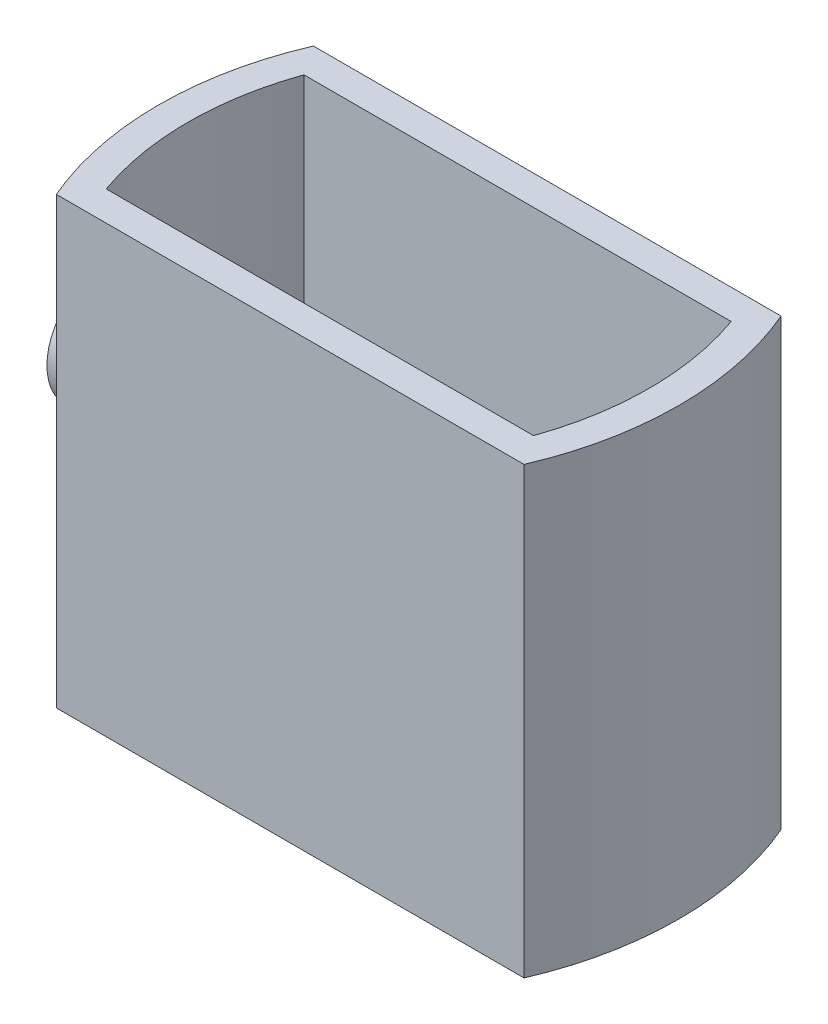
ISO-10303-21;
HEADER;
FILE_DESCRIPTION(('STEP AP214'),'2;1');
FILE_NAME('part.step','',(''),(''),'','','');
FILE_SCHEMA(('AUTOMOTIVE_DESIGN { 1 0 10303 214 1 1 1 1 }'));
ENDSEC;
DATA;
#1=APPLICATION_CONTEXT('core data for automotive mechanical design processes');
#2=APPLICATION_PROTOCOL_DEFINITION('international standard','automotive_design',2000,#1);
#3=PRODUCT_CONTEXT('',#1,'mechanical');
#4=PRODUCT('Part','Part','',(#3));
#5=PRODUCT_RELATED_PRODUCT_CATEGORY('part','',(#4));
#6=PRODUCT_DEFINITION_FORMATION('','',#4);
#7=PRODUCT_DEFINITION_CONTEXT('part definition',#1,'design');
#8=PRODUCT_DEFINITION('design','',#6,#7);
#9=PRODUCT_DEFINITION_SHAPE('','',#8);
#10=(LENGTH_UNIT() NAMED_UNIT(*) SI_UNIT(.MILLI.,.METRE.));
#11=(NAMED_UNIT(*) PLANE_ANGLE_UNIT() SI_UNIT($,.RADIAN.));
#12=(NAMED_UNIT(*) SI_UNIT($,.STERADIAN.) SOLID_ANGLE_UNIT());
#13=UNCERTAINTY_MEASURE_WITH_UNIT(LENGTH_MEASURE(1.E-05),#10,'distance_accuracy_value','');
#14=(GEOMETRIC_REPRESENTATION_CONTEXT(3) GLOBAL_UNCERTAINTY_ASSIGNED_CONTEXT((#13)) GLOBAL_UNIT_ASSIGNED_CONTEXT((#10,
#11,#12)) REPRESENTATION_CONTEXT('',''));
#15=CARTESIAN_POINT('',(0.,0.,0.));
#16=DIRECTION('',(0.,0.,1.));
#17=DIRECTION('',(1.,0.,0.));
#18=AXIS2_PLACEMENT_3D('',#15,#16,#17);
#19=CARTESIAN_POINT('',(33.2842712474619,45.,-10.));
#20=DIRECTION('',(0.,-1.,0.));
#21=DIRECTION('',(0.,0.,-1.));
#22=AXIS2_PLACEMENT_3D('',#19,#20,#21);
#23=CYLINDRICAL_SURFACE('',#22,33.);
#24=CARTESIAN_POINT('',(33.2842712474619,0.,-10.));
#25=DIRECTION('',(0.,1.,0.));
#26=DIRECTION('',(0.,0.,1.));
#27=AXIS2_PLACEMENT_3D('',#24,#25,#26);
#28=CIRCLE('',#27,33.);
#29=CARTESIAN_POINT('',(2.95276947125568,0.,-23.));
#30=VERTEX_POINT('',#29);
#31=CARTESIAN_POINT('',(2.9527694712557,0.,3.));
#32=VERTEX_POINT('',#31);
#33=EDGE_CURVE('E180',#30,#32,#28,.T.);
#34=ORIENTED_EDGE('',*,*,#33,.T.);
#35=DIRECTION('',(0.,-1.,0.));
#36=VECTOR('',#35,1.);
#37=CARTESIAN_POINT('',(2.9527694712557,45.,3.));
#38=LINE('',#37,#36);
#39=CARTESIAN_POINT('',(2.9527694712557,45.,3.));
#40=VERTEX_POINT('',#39);
#41=EDGE_CURVE('E207',#40,#32,#38,.T.);
#42=ORIENTED_EDGE('',*,*,#41,.F.);
#43=CARTESIAN_POINT('',(33.2842712474619,45.,-10.));
#44=DIRECTION('',(0.,1.,0.));
#45=DIRECTION('',(0.,0.,1.));
#46=AXIS2_PLACEMENT_3D('',#43,#44,#45);
#47=CIRCLE('',#46,33.);
#48=CARTESIAN_POINT('',(2.95276947125568,45.,-23.));
#49=VERTEX_POINT('',#48);
#50=EDGE_CURVE('E181',#49,#40,#47,.T.);
#51=ORIENTED_EDGE('',*,*,#50,.F.);
#52=DIRECTION('',(0.,-1.,0.));
#53=VECTOR('',#52,1.);
#54=CARTESIAN_POINT('',(2.95276947125568,45.,-23.));
#55=LINE('',#54,#53);
#56=EDGE_CURVE('E191',#49,#30,#55,.T.);
#57=ORIENTED_EDGE('',*,*,#56,.T.);
#58=EDGE_LOOP('',(#34,#42,#51,#57));
#59=FACE_BOUND('',#58,.T.);
#60=CARTESIAN_POINT('',(0.834309768285982,22.5298800502734,-4.));
#61=CARTESIAN_POINT('',(0.834311207050992,22.6969470468249,-3.99999710433349));
#62=CARTESIAN_POINT('',(0.833017102269688,22.8639762389532,-4.00697986993228));
#63=CARTESIAN_POINT('',(0.827881797372019,23.1968817985023,-4.03485125201145));
#64=CARTESIAN_POINT('',(0.824040124479655,23.3627579461672,-4.05574244961225));
#65=CARTESIAN_POINT('',(0.813917556073885,23.6922074969818,-4.11128853761444));
#66=CARTESIAN_POINT('',(0.807635234979211,23.8557794963096,-4.14595147234873));
#67=CARTESIAN_POINT('',(0.792812964129984,24.1794261892272,-4.22878622637898));
#68=CARTESIAN_POINT('',(0.784272184587287,24.3394995739275,-4.27696301124231));
#69=CARTESIAN_POINT('',(0.765194002031665,24.6547597342547,-4.38638333662461));
#70=CARTESIAN_POINT('',(0.754659182785857,24.8099525337316,-4.44760998065251));
#71=CARTESIAN_POINT('',(0.731883148899789,25.11465548327,-4.58273848642752));
#72=CARTESIAN_POINT('',(0.719641305397532,25.2641635131302,-4.65664502172616));
#73=CARTESIAN_POINT('',(0.693806914762158,25.5563526088892,-4.81654681687286));
#74=CARTESIAN_POINT('',(0.68021500803482,25.6990368645254,-4.90253635307126));
#75=CARTESIAN_POINT('',(0.652050718739532,25.9767497303918,-5.08606047704174));
#76=CARTESIAN_POINT('',(0.637477971804304,26.1117754608884,-5.18359936555333));
#77=CARTESIAN_POINT('',(0.607609903109034,26.3745400520298,-5.39057029759614));
#78=CARTESIAN_POINT('',(0.592308758957431,26.5021912848753,-5.50011276599489));
#79=CARTESIAN_POINT('',(0.561546625216796,26.747885647199,-5.72955598579486));
#80=CARTESIAN_POINT('',(0.546085578517219,26.8659252001229,-5.84946055908649));
#81=CARTESIAN_POINT('',(0.515445816845272,27.0915033105964,-6.09873859480213));
#82=CARTESIAN_POINT('',(0.500267017898053,27.1990450332953,-6.22810918246445));
#83=CARTESIAN_POINT('',(0.470604333153024,27.4029611080186,-6.4955221832749));
#84=CARTESIAN_POINT('',(0.456120705554213,27.4993313292708,-6.63356777518038));
#85=CARTESIAN_POINT('',(0.428163516937484,27.6807936475005,-6.91831497645332));
#86=CARTESIAN_POINT('',(0.414697492304395,27.7658046157517,-7.06506905345363));
#87=CARTESIAN_POINT('',(0.389262221119081,27.9231769250129,-7.36540209909515));
#88=CARTESIAN_POINT('',(0.377293535155045,27.9955335323709,-7.51898359485917));
#89=CARTESIAN_POINT('',(0.355205254476122,28.126986202578,-7.83178536210799));
#90=CARTESIAN_POINT('',(0.345084864877921,28.1860879683452,-7.99100317428556));
#91=CARTESIAN_POINT('',(0.326970831275491,28.2906319898892,-8.31399646768902));
#92=CARTESIAN_POINT('',(0.318977962306166,28.3360692686076,-8.47777358589203));
#93=CARTESIAN_POINT('',(0.298719547884425,28.4503964023707,-8.97043441500052));
#94=CARTESIAN_POINT('',(0.289896994150371,28.4988974909288,-9.30446143905058));
#95=CARTESIAN_POINT('',(0.282569638067994,28.5392610535621,-9.97583675238667));
#96=CARTESIAN_POINT('',(0.284064007406454,28.5311280746077,-10.3131847728688));
#97=CARTESIAN_POINT('',(0.297102792372699,28.4590030153549,-10.9776541129842));
#98=CARTESIAN_POINT('',(0.308528616351763,28.3956700545941,-11.3048490887181));
#99=CARTESIAN_POINT('',(0.340018545015216,28.2159636930678,-11.9438760833778));
#100=CARTESIAN_POINT('',(0.360082950405559,28.0995884459108,-12.2557075670849));
#101=CARTESIAN_POINT('',(0.406793716014287,27.8164705373666,-12.8570977010309));
#102=CARTESIAN_POINT('',(0.433474678133732,27.6494620287455,-13.1465284160774));
#103=CARTESIAN_POINT('',(0.490464321434872,27.2700124699342,-13.6935031622188));
#104=CARTESIAN_POINT('',(0.520773350166418,27.0575670655903,-13.9510441336273));
#105=CARTESIAN_POINT('',(0.582174010526942,26.5896346620641,-14.4308332800817));
#106=CARTESIAN_POINT('',(0.613270624471893,26.3335709899584,-14.6525187629826));
#107=CARTESIAN_POINT('',(0.672322383831015,25.7875978650687,-15.0498781780911));
#108=CARTESIAN_POINT('',(0.700277488531327,25.4976879737382,-15.225551514022));
#109=CARTESIAN_POINT('',(0.749887045610989,24.8915325170496,-15.526046142352));
#110=CARTESIAN_POINT('',(0.771531847279287,24.5752475548737,-15.6507896602823));
#111=CARTESIAN_POINT('',(0.805919242954319,23.9257277010885,-15.8452113078842));
#112=CARTESIAN_POINT('',(0.818662780964874,23.592494610898,-15.9148952768771));
#113=CARTESIAN_POINT('',(0.833619125028542,22.923600646495,-15.9964065355699));
#114=CARTESIAN_POINT('',(0.835978737170392,22.5880412520994,-16.0090404560043));
#115=CARTESIAN_POINT('',(0.830292394132216,21.9196063987343,-15.9782516420348));
#116=CARTESIAN_POINT('',(0.822246921235445,21.5867308160877,-15.9348315057775));
#117=CARTESIAN_POINT('',(0.796793365566566,20.9357390176699,-15.7938582944236));
#118=CARTESIAN_POINT('',(0.779457846360131,20.6175288965994,-15.6967245852953));
#119=CARTESIAN_POINT('',(0.737439524304479,20.0019008954381,-15.4515249075209));
#120=CARTESIAN_POINT('',(0.712756208356009,19.7044844691701,-15.3034553818964));
#121=CARTESIAN_POINT('',(0.658487219924136,19.1353224560069,-14.9587176597247));
#122=CARTESIAN_POINT('',(0.628851091161043,18.863891672688,-14.7615378161347));
#123=CARTESIAN_POINT('',(0.568159269713723,18.3576789988143,-14.3248688706109));
#124=CARTESIAN_POINT('',(0.537103457505208,18.1229002013933,-14.0853762014456));
#125=CARTESIAN_POINT('',(0.476601624494936,17.6936614236151,-13.567289950794));
#126=CARTESIAN_POINT('',(0.447180606477683,17.4997426530667,-13.288244641256));
#127=CARTESIAN_POINT('',(0.393678962304662,17.1615414631335,-12.7010539158412));
#128=CARTESIAN_POINT('',(0.369598139367316,17.0172572146513,-12.3929095728356));
#129=CARTESIAN_POINT('',(0.329595488360193,16.783234704372,-11.7578593043535));
#130=CARTESIAN_POINT('',(0.313633234144535,16.6932257558349,-11.4310555340042));
#131=CARTESIAN_POINT('',(0.29150348307946,16.5694625997388,-10.7664654063309));
#132=CARTESIAN_POINT('',(0.285335019803886,16.5357028416377,-10.4286801359904));
#133=CARTESIAN_POINT('',(0.283933032375379,16.5280337160894,-9.92412465964711));
#134=CARTESIAN_POINT('',(0.284742665578209,16.5324667293458,-9.75741956133508));
#135=CARTESIAN_POINT('',(0.288863907032769,16.5551771273463,-9.42500311314808));
#136=CARTESIAN_POINT('',(0.292174571683086,16.5734492907946,-9.25929141223973));
#137=CARTESIAN_POINT('',(0.301211473783175,16.6237112415082,-8.92998180037912));
#138=CARTESIAN_POINT('',(0.306938560346232,16.6557058508078,-8.76638465331259));
#139=CARTESIAN_POINT('',(0.320645292898395,16.7331491184936,-8.44256296011904));
#140=CARTESIAN_POINT('',(0.328624130104579,16.7785929464795,-8.28233722521298));
#141=CARTESIAN_POINT('',(0.346603965841608,16.8825320386561,-7.96651394513209));
#142=CARTESIAN_POINT('',(0.356602475212811,16.9410112463935,-7.81091097078312));
#143=CARTESIAN_POINT('',(0.378349465815467,17.0705976414067,-7.5052492813374));
#144=CARTESIAN_POINT('',(0.390097322641404,17.1417003246408,-7.35518861174606));
#145=CARTESIAN_POINT('',(0.415030408686995,17.2960674330648,-7.06150782553733));
#146=CARTESIAN_POINT('',(0.428216211947667,17.3793367198124,-6.91789031361532));
#147=CARTESIAN_POINT('',(0.455658298588059,17.5573997108216,-6.63816743173614));
#148=CARTESIAN_POINT('',(0.46991420839022,17.6521894003632,-6.5020594686973));
#149=CARTESIAN_POINT('',(0.499317594449547,17.854060084822,-6.23636768521799));
#150=CARTESIAN_POINT('',(0.514474700989465,17.9612934565583,-6.10690067916726));
#151=CARTESIAN_POINT('',(0.545069769387928,18.1861817415128,-5.8574800030546));
#152=CARTESIAN_POINT('',(0.560507629742685,18.3038329455304,-5.73752297562916));
#153=CARTESIAN_POINT('',(0.591248598227235,18.5488615714,-5.50781686444138));
#154=CARTESIAN_POINT('',(0.606551620193833,18.6762447712566,-5.39807393202892));
#155=CARTESIAN_POINT('',(0.636578866441934,18.9397626429322,-5.1896709743231));
#156=CARTESIAN_POINT('',(0.651303301762846,19.0758940751781,-5.09100688316674));
#157=CARTESIAN_POINT('',(0.679891949863692,19.3572924900959,-4.90456782351758));
#158=CARTESIAN_POINT('',(0.693747212192895,19.502630759713,-4.81689902638604));
#159=CARTESIAN_POINT('',(0.720044012545855,19.8002540529136,-4.65417002493858));
#160=CARTESIAN_POINT('',(0.7324860705455,19.9525364923594,-4.57910517821784));
#161=CARTESIAN_POINT('',(0.75558956002518,20.2629313678491,-4.44215023459087));
#162=CARTESIAN_POINT('',(0.766252164471846,20.4210398789137,-4.38025145153159));
#163=CARTESIAN_POINT('',(0.785488942716035,20.7419956122943,-4.27005527885427));
#164=CARTESIAN_POINT('',(0.794063546153581,20.9048418520126,-4.22175509078507));
#165=CARTESIAN_POINT('',(0.81217650811176,21.3078028745834,-4.12064396841226));
#166=CARTESIAN_POINT('',(0.82043372775197,21.5499322645336,-4.07545977914677));
#167=CARTESIAN_POINT('',(0.831499232565769,22.0380284785789,-4.01514029257442));
#168=CARTESIAN_POINT('',(0.834307650749223,22.2839952088537,-4.00000426176632));
#169=CARTESIAN_POINT('',(0.834309768285982,22.5298800502734,-4.));
#170=B_SPLINE_CURVE_WITH_KNOTS('',3,(#60,#61,#62,#63,#64,#65,#66,#67,#68,#69,#70,#71,#72,#73,
#74,#75,#76,#77,#78,#79,#80,#81,#82,#83,#84,#85,#86,#87,#88,#89,#90,#91,#92,#93,#94,#95,#96,#97,
#98,#99,#100,#101,#102,#103,#104,#105,#106,#107,#108,#109,#110,#111,#112,#113,#114,#115,#116,
#117,#118,#119,#120,#121,#122,#123,#124,#125,#126,#127,#128,#129,#130,#131,#132,#133,#134,#135,
#136,#137,#138,#139,#140,#141,#142,#143,#144,#145,#146,#147,#148,#149,#150,#151,#152,#153,#154,
#155,#156,#157,#158,#159,#160,#161,#162,#163,#164,#165,#166,#167,#168,#169),.UNSPECIFIED.,.T.,
.F.,(4,2,2,2,2,2,2,2,2,2,2,2,2,2,2,2,2,2,2,2,2,2,2,2,2,2,2,2,2,2,2,2,2,2,2,2,2,2,2,2,2,2,2,2,2,
2,2,2,2,2,2,2,2,2,4),(0.,0.500985141416481,1.00206328135099,1.50343454186193,2.00499026951617,
2.50590050338956,3.00699576084691,3.50785444749858,4.00890023359659,4.51501940801334,
5.02132605937388,5.5274795821203,6.03381966712669,6.54360211345409,7.05357484952594,
7.56332774621864,8.07326608753258,9.08087313825729,10.0883992923303,11.0840573145674,
12.0797499981095,13.0807638104178,14.0818735914816,15.0974244812227,16.112988530953,
17.1300976903803,18.147098966162,19.1496748952068,20.152204355794,21.1470149256815,
22.1418949798464,23.14760856284,24.1534069741702,25.171789632904,26.1901347588785,
27.2033581660772,28.216481584775,28.7162920469878,29.2159140323754,29.7157117277426,
30.2153301339433,30.7143364981072,31.2131651738708,31.7121937205521,32.2110488578404,
32.7168299197649,33.2224316202422,33.7283358709149,34.2340538469723,34.7443303702752,
35.2544185294921,35.7641691131274,36.2738147185242,37.0111695626684,37.7485064071289),.UNSPECIFIED.);
#171=CARTESIAN_POINT('',(0.834309768285982,22.5298800502734,-4.));
#172=VERTEX_POINT('',#171);
#173=EDGE_CURVE('E11',#172,#172,#170,.T.);
#174=ORIENTED_EDGE('',*,*,#173,.F.);
#175=EDGE_LOOP('',(#174));
#176=FACE_BOUND('',#175,.T.);
#177=ADVANCED_FACE('F34',(#59,#176),#23,.T.);
#178=CARTESIAN_POINT('',(19.9442712474619,45.,-10.));
#179=DIRECTION('',(0.,-1.,0.));
#180=DIRECTION('',(0.,0.,-1.));
#181=AXIS2_PLACEMENT_3D('',#178,#179,#180);
#182=CYLINDRICAL_SURFACE('',#181,30.);
#183=DIRECTION('',(0.,-1.,0.));
#184=VECTOR('',#183,1.);
#185=CARTESIAN_POINT('',(48.2285424949238,45.,-20.));
#186=LINE('',#185,#184);
#187=CARTESIAN_POINT('',(48.2285424949238,45.,-20.));
#188=VERTEX_POINT('',#187);
#189=CARTESIAN_POINT('',(48.2285424949238,3.,-20.));
#190=VERTEX_POINT('',#189);
#191=EDGE_CURVE('E178',#188,#190,#186,.T.);
#192=ORIENTED_EDGE('',*,*,#191,.T.);
#193=CARTESIAN_POINT('',(19.9442712474619,3.,-10.));
#194=DIRECTION('',(0.,-1.,0.));
#195=DIRECTION('',(0.,0.,-1.));
#196=AXIS2_PLACEMENT_3D('',#193,#194,#195);
#197=CIRCLE('',#196,30.);
#198=CARTESIAN_POINT('',(48.2285424949238,3.,0.));
#199=VERTEX_POINT('',#198);
#200=EDGE_CURVE('E149',#190,#199,#197,.T.);
#201=ORIENTED_EDGE('',*,*,#200,.T.);
#202=DIRECTION('',(0.,-1.,0.));
#203=VECTOR('',#202,1.);
#204=CARTESIAN_POINT('',(48.2285424949238,45.,0.));
#205=LINE('',#204,#203);
#206=CARTESIAN_POINT('',(48.2285424949238,45.,0.));
#207=VERTEX_POINT('',#206);
#208=EDGE_CURVE('E171',#207,#199,#205,.T.);
#209=ORIENTED_EDGE('',*,*,#208,.F.);
#210=CARTESIAN_POINT('',(19.9442712474619,45.,-10.));
#211=DIRECTION('',(0.,1.,0.));
#212=DIRECTION('',(0.,0.,-1.));
#213=AXIS2_PLACEMENT_3D('',#210,#211,#212);
#214=CIRCLE('',#213,30.);
#215=EDGE_CURVE('E165',#207,#188,#214,.T.);
#216=ORIENTED_EDGE('',*,*,#215,.T.);
#217=EDGE_LOOP('',(#192,#201,#209,#216));
#218=FACE_BOUND('',#217,.T.);
#219=ADVANCED_FACE('F225',(#218),#182,.F.);
#220=CARTESIAN_POINT('',(4.99999999999999,45.,-20.));
#221=DIRECTION('',(0.,0.,1.));
#222=DIRECTION('',(1.,0.,0.));
#223=AXIS2_PLACEMENT_3D('',#220,#221,#222);
#224=PLANE('',#223);
#225=DIRECTION('',(0.,-1.,0.));
#226=VECTOR('',#225,1.);
#227=CARTESIAN_POINT('',(38.1142712474619,3.,-20.));
#228=LINE('',#227,#226);
#229=CARTESIAN_POINT('',(38.1142712474619,3.,-20.));
#230=VERTEX_POINT('',#229);
#231=CARTESIAN_POINT('',(38.1142712474619,0.,-20.));
#232=VERTEX_POINT('',#231);
#233=EDGE_CURVE('E133',#230,#232,#228,.T.);
#234=ORIENTED_EDGE('',*,*,#233,.F.);
#235=DIRECTION('',(1.,0.,0.));
#236=VECTOR('',#235,1.);
#237=CARTESIAN_POINT('',(4.99999999999999,3.,-20.));
#238=LINE('',#237,#236);
#239=EDGE_CURVE('E152',#230,#190,#238,.T.);
#240=ORIENTED_EDGE('',*,*,#239,.T.);
#241=ORIENTED_EDGE('',*,*,#191,.F.);
#242=DIRECTION('',(-1.,0.,0.));
#243=VECTOR('',#242,1.);
#244=CARTESIAN_POINT('',(4.99999999999999,45.,-20.));
#245=LINE('',#244,#243);
#246=CARTESIAN_POINT('',(4.99999999999999,45.,-20.));
#247=VERTEX_POINT('',#246);
#248=EDGE_CURVE('E220',#188,#247,#245,.T.);
#249=ORIENTED_EDGE('',*,*,#248,.T.);
#250=DIRECTION('',(0.,-1.,0.));
#251=VECTOR('',#250,1.);
#252=CARTESIAN_POINT('',(4.99999999999999,45.,-20.));
#253=LINE('',#252,#251);
#254=CARTESIAN_POINT('',(4.99999999999999,3.,-20.));
#255=VERTEX_POINT('',#254);
#256=EDGE_CURVE('E148',#247,#255,#253,.T.);
#257=ORIENTED_EDGE('',*,*,#256,.T.);
#258=CARTESIAN_POINT('',(15.1142712474619,3.,-20.));
#259=VERTEX_POINT('',#258);
#260=EDGE_CURVE('E138',#255,#259,#238,.T.);
#261=ORIENTED_EDGE('',*,*,#260,.T.);
#262=DIRECTION('',(0.,-1.,0.));
#263=VECTOR('',#262,1.);
#264=CARTESIAN_POINT('',(15.1142712474619,3.,-20.));
#265=LINE('',#264,#263);
#266=CARTESIAN_POINT('',(15.1142712474619,0.,-20.));
#267=VERTEX_POINT('',#266);
#268=EDGE_CURVE('E125',#259,#267,#265,.T.);
#269=ORIENTED_EDGE('',*,*,#268,.T.);
#270=DIRECTION('',(-1.,0.,0.));
#271=VECTOR('',#270,1.);
#272=CARTESIAN_POINT('',(4.99999999999999,0.,-20.));
#273=LINE('',#272,#271);
#274=EDGE_CURVE('E158',#232,#267,#273,.T.);
#275=ORIENTED_EDGE('',*,*,#274,.F.);
#276=EDGE_LOOP('',(#234,#240,#241,#249,#257,#261,#269,#275));
#277=FACE_BOUND('',#276,.T.);
#278=ADVANCED_FACE('F146',(#277),#224,.T.);
#279=CARTESIAN_POINT('',(33.2842712474619,45.,-10.));
#280=DIRECTION('',(0.,-1.,0.));
#281=DIRECTION('',(0.,0.,-1.));
#282=AXIS2_PLACEMENT_3D('',#279,#280,#281);
#283=CYLINDRICAL_SURFACE('',#282,30.);
#284=CARTESIAN_POINT('',(3.4346481342633,22.5298800502734,-7.));
#285=CARTESIAN_POINT('',(3.43464616380183,22.3618213577466,-7.0000072798201));
#286=CARTESIAN_POINT('',(3.43321353877771,22.1936515450184,-7.01416942305608));
#287=CARTESIAN_POINT('',(3.42763862189589,21.8619744913745,-7.07045105571267));
#288=CARTESIAN_POINT('',(3.42349334394082,21.6984725961573,-7.11260135534101));
#289=CARTESIAN_POINT('',(3.41296725572507,21.3809825926261,-7.22361965179192));
#290=CARTESIAN_POINT('',(3.40658780097375,21.2269887821008,-7.29247145111795));
#291=CARTESIAN_POINT('',(3.39231383039174,20.9327766733964,-7.45490719782704));
#292=CARTESIAN_POINT('',(3.38441961555469,20.7925556468218,-7.54848623312231));
#293=CARTESIAN_POINT('',(3.36797344614221,20.5293262593013,-7.75808571400379));
#294=CARTESIAN_POINT('',(3.35941944729782,20.4063750217621,-7.8741777456752));
#295=CARTESIAN_POINT('',(3.34263609039642,20.1816672232625,-8.12535485404133));
#296=CARTESIAN_POINT('',(3.33440674720715,20.0799116320544,-8.2604407992803));
#297=CARTESIAN_POINT('',(3.31917975279212,19.9002862792519,-8.54612091504703));
#298=CARTESIAN_POINT('',(3.31218472062205,19.8224670538924,-8.69674701241129));
#299=CARTESIAN_POINT('',(3.30023674118922,19.6932467508273,-9.00901004713747));
#300=CARTESIAN_POINT('',(3.2952837441501,19.641845029165,-9.17064671599534));
#301=CARTESIAN_POINT('',(3.28799225033101,19.5670863222136,-9.49976565177115));
#302=CARTESIAN_POINT('',(3.28564501217736,19.5436355520235,-9.66722641890525));
#303=CARTESIAN_POINT('',(3.28379977950115,19.5251542428722,-10.0037222220668));
#304=CARTESIAN_POINT('',(3.28430171110373,19.5301229670346,-10.1727572171634));
#305=CARTESIAN_POINT('',(3.28809110812632,19.5682634682238,-10.5069665321937));
#306=CARTESIAN_POINT('',(3.29136861291051,19.601334396965,-10.6721524898049));
#307=CARTESIAN_POINT('',(3.30032936951399,19.6945834371132,-10.9946175385136));
#308=CARTESIAN_POINT('',(3.3060126525833,19.7547619006361,-11.1518965268732));
#309=CARTESIAN_POINT('',(3.31916312294444,19.9006283400367,-11.4544009440388));
#310=CARTESIAN_POINT('',(3.32663342648916,19.9863609428638,-11.5996047129449));
#311=CARTESIAN_POINT('',(3.34251971187967,20.1808696202825,-11.8736005395226));
#312=CARTESIAN_POINT('',(3.35093572145757,20.2896463707089,-12.0023921156825));
#313=CARTESIAN_POINT('',(3.36781244342635,20.5277227388143,-12.2404983154681));
#314=CARTESIAN_POINT('',(3.37627319027107,20.6571100844981,-12.349725238571));
#315=CARTESIAN_POINT('',(3.39224904961523,20.9324306459057,-12.5449226060737));
#316=CARTESIAN_POINT('',(3.39976416074297,21.0783638856298,-12.6308930167387));
#317=CARTESIAN_POINT('',(3.41299856203742,21.3827011258727,-12.7771365537197));
#318=CARTESIAN_POINT('',(3.41871747348526,21.541107747542,-12.8374042617189));
#319=CARTESIAN_POINT('',(3.42770419133376,21.8658618641174,-12.9304622069128));
#320=CARTESIAN_POINT('',(3.43097207240885,22.0322091169357,-12.9632532812291));
#321=CARTESIAN_POINT('',(3.43467383163939,22.3673525888619,-13.0003143261759));
#322=CARTESIAN_POINT('',(3.4351199010338,22.5361351110679,-13.0047069899416));
#323=CARTESIAN_POINT('',(3.43315970681875,22.872033847742,-12.9851687406141));
#324=CARTESIAN_POINT('',(3.43075348175006,23.0391500846945,-12.9612382102293));
#325=CARTESIAN_POINT('',(3.42337091478985,23.3666147971084,-12.8858355235226));
#326=CARTESIAN_POINT('',(3.41839998742153,23.5269767635573,-12.8344213815667));
#327=CARTESIAN_POINT('',(3.40645251629806,23.8368002054643,-12.7055701590278));
#328=CARTESIAN_POINT('',(3.39947592660181,23.9862614311349,-12.6281324823508));
#329=CARTESIAN_POINT('',(3.38427371679049,24.2705999723597,-12.4491250042696));
#330=CARTESIAN_POINT('',(3.37604392302175,24.4054258761721,-12.3474738995221));
#331=CARTESIAN_POINT('',(3.35927626870631,24.6561452100956,-12.1230416003535));
#332=CARTESIAN_POINT('',(3.35073840053592,24.7720381712936,-12.0002598827444));
#333=CARTESIAN_POINT('',(3.33427981198284,24.9820249504676,-11.7365194126794));
#334=CARTESIAN_POINT('',(3.32636142579767,25.076038729032,-11.5954967679084));
#335=CARTESIAN_POINT('',(3.31206798426299,25.2390476557926,-11.2995931522514));
#336=CARTESIAN_POINT('',(3.30569290776713,25.3080431467947,-11.1447123712889));
#337=CARTESIAN_POINT('',(3.29521493504173,25.4189213532394,-10.8257683792984));
#338=CARTESIAN_POINT('',(3.29110798929244,25.460852412249,-10.6617221129499));
#339=CARTESIAN_POINT('',(3.28561240905243,25.5165692590129,-10.328874441951));
#340=CARTESIAN_POINT('',(3.28422369816501,25.5303558377755,-10.1600731710767));
#341=CARTESIAN_POINT('',(3.28432109806381,25.5293812509535,-9.82329332777276));
#342=CARTESIAN_POINT('',(3.28579469616182,25.5147443397634,-9.65531437832642));
#343=CARTESIAN_POINT('',(3.29142644013417,25.4575988133024,-9.32421433493091));
#344=CARTESIAN_POINT('',(3.29558458811569,25.4150901761545,-9.1610932447949));
#345=CARTESIAN_POINT('',(3.30611953304306,25.3034422780946,-8.84434027369677));
#346=CARTESIAN_POINT('',(3.31249602736446,25.2343066494709,-8.69070710176741));
#347=CARTESIAN_POINT('',(3.32675687497299,25.0713805435224,-8.39720619953561));
#348=CARTESIAN_POINT('',(3.33464121943715,24.97759021046,-8.25733838869432));
#349=CARTESIAN_POINT('',(3.35107570739036,24.7675511932021,-7.99470182671918));
#350=CARTESIAN_POINT('',(3.35962850364134,24.651210001539,-7.87200722134198));
#351=CARTESIAN_POINT('',(3.37641352437173,24.399553995637,-7.64782672182057));
#352=CARTESIAN_POINT('',(3.38464567142705,24.2642346347662,-7.54634592445645));
#353=CARTESIAN_POINT('',(3.39987974514542,23.9780870245136,-7.36727007872784));
#354=CARTESIAN_POINT('',(3.40687848970849,23.8272202063011,-7.28973643601551));
#355=CARTESIAN_POINT('',(3.41881540458228,23.5146351765347,-7.16120587570368));
#356=CARTESIAN_POINT('',(3.4237558978396,23.3529294384965,-7.11017902633037));
#357=CARTESIAN_POINT('',(3.42977102133165,23.0802368275759,-7.04883493499945));
#358=CARTESIAN_POINT('',(3.43159128943526,22.9709932963536,-7.03054686280544));
#359=CARTESIAN_POINT('',(3.43403049208782,22.7511425811462,-7.00612702418454));
#360=CARTESIAN_POINT('',(3.43464943167973,22.6405354028875,-6.99999520672778));
#361=CARTESIAN_POINT('',(3.4346481342633,22.5298800502734,-7.));
#362=B_SPLINE_CURVE_WITH_KNOTS('',3,(#284,#285,#286,#287,#288,#289,#290,#291,#292,#293,#294,
#295,#296,#297,#298,#299,#300,#301,#302,#303,#304,#305,#306,#307,#308,#309,#310,#311,#312,#313,
#314,#315,#316,#317,#318,#319,#320,#321,#322,#323,#324,#325,#326,#327,#328,#329,#330,#331,#332,
#333,#334,#335,#336,#337,#338,#339,#340,#341,#342,#343,#344,#345,#346,#347,#348,#349,#350,#351,
#352,#353,#354,#355,#356,#357,#358,#359,#360,#361),.UNSPECIFIED.,.T.,.F.,(4,2,2,2,2,2,2,2,2,2,2,
2,2,2,2,2,2,2,2,2,2,2,2,2,2,2,2,2,2,2,2,2,2,2,2,2,2,2,4),(0.,0.503771983318809,1.00809945548361,
1.51212147301072,2.01604344128225,2.52159484591606,3.02716937567589,3.53380409915705,
4.04042647225214,4.54534412697179,5.05024868996527,5.55334895457815,6.05645575444753,
6.5604463640107,7.06445175657416,7.57066275256834,8.07687448284519,8.58319287355631,
9.08949583786929,9.59360988925126,10.0977171290244,10.6007644411541,11.1038232768497,
11.6085956943698,12.1133806117144,12.6199841045619,13.1265806555585,13.6322697808491,
14.1379446934128,14.6414140040728,15.144883709918,15.6482847598757,16.1516828643423,
16.6571914511579,17.162821351054,17.6697372321326,18.1760794468383,18.5077808281997,
18.8394808171328),.UNSPECIFIED.);
#363=CARTESIAN_POINT('',(3.4346481342633,22.5298800502734,-7.));
#364=VERTEX_POINT('',#363);
#365=EDGE_CURVE('E285',#364,#364,#362,.T.);
#366=ORIENTED_EDGE('',*,*,#365,.F.);
#367=EDGE_LOOP('',(#366));
#368=FACE_BOUND('',#367,.T.);
#369=DIRECTION('',(0.,-1.,0.));
#370=VECTOR('',#369,1.);
#371=CARTESIAN_POINT('',(5.,45.,0.));
#372=LINE('',#371,#370);
#373=CARTESIAN_POINT('',(5.,45.,0.));
#374=VERTEX_POINT('',#373);
#375=CARTESIAN_POINT('',(5.,3.,0.));
#376=VERTEX_POINT('',#375);
#377=EDGE_CURVE('E174',#374,#376,#372,.T.);
#378=ORIENTED_EDGE('',*,*,#377,.T.);
#379=CARTESIAN_POINT('',(33.2842712474619,3.,-10.));
#380=DIRECTION('',(0.,-1.,0.));
#381=DIRECTION('',(0.,0.,-1.));
#382=AXIS2_PLACEMENT_3D('',#379,#380,#381);
#383=CIRCLE('',#382,30.);
#384=EDGE_CURVE('E150',#376,#255,#383,.T.);
#385=ORIENTED_EDGE('',*,*,#384,.T.);
#386=ORIENTED_EDGE('',*,*,#256,.F.);
#387=CARTESIAN_POINT('',(33.2842712474619,45.,-10.));
#388=DIRECTION('',(0.,1.,0.));
#389=DIRECTION('',(0.,0.,1.));
#390=AXIS2_PLACEMENT_3D('',#387,#388,#389);
#391=CIRCLE('',#390,30.);
#392=EDGE_CURVE('E216',#247,#374,#391,.T.);
#393=ORIENTED_EDGE('',*,*,#392,.T.);
#394=EDGE_LOOP('',(#378,#385,#386,#393));
#395=FACE_BOUND('',#394,.T.);
#396=ADVANCED_FACE('F214',(#368,#395),#283,.F.);
#397=CARTESIAN_POINT('',(5.,45.,0.));
#398=DIRECTION('',(0.,0.,-1.));
#399=DIRECTION('',(-1.,0.,0.));
#400=AXIS2_PLACEMENT_3D('',#397,#398,#399);
#401=PLANE('',#400);
#402=DIRECTION('',(1.,0.,0.));
#403=VECTOR('',#402,1.);
#404=CARTESIAN_POINT('',(5.,0.,0.));
#405=LINE('',#404,#403);
#406=CARTESIAN_POINT('',(15.1142712474619,0.,0.));
#407=VERTEX_POINT('',#406);
#408=CARTESIAN_POINT('',(38.1142712474619,0.,0.));
#409=VERTEX_POINT('',#408);
#410=EDGE_CURVE('E161',#407,#409,#405,.T.);
#411=ORIENTED_EDGE('',*,*,#410,.F.);
#412=DIRECTION('',(0.,-1.,0.));
#413=VECTOR('',#412,1.);
#414=CARTESIAN_POINT('',(15.1142712474619,3.,0.));
#415=LINE('',#414,#413);
#416=CARTESIAN_POINT('',(15.1142712474619,3.,0.));
#417=VERTEX_POINT('',#416);
#418=EDGE_CURVE('E155',#417,#407,#415,.T.);
#419=ORIENTED_EDGE('',*,*,#418,.F.);
#420=DIRECTION('',(-1.,0.,0.));
#421=VECTOR('',#420,1.);
#422=CARTESIAN_POINT('',(5.,3.,0.));
#423=LINE('',#422,#421);
#424=EDGE_CURVE('E141',#417,#376,#423,.T.);
#425=ORIENTED_EDGE('',*,*,#424,.T.);
#426=ORIENTED_EDGE('',*,*,#377,.F.);
#427=DIRECTION('',(1.,0.,0.));
#428=VECTOR('',#427,1.);
#429=CARTESIAN_POINT('',(5.,45.,0.));
#430=LINE('',#429,#428);
#431=EDGE_CURVE('E168',#374,#207,#430,.T.);
#432=ORIENTED_EDGE('',*,*,#431,.T.);
#433=ORIENTED_EDGE('',*,*,#208,.T.);
#434=CARTESIAN_POINT('',(38.1142712474619,3.,0.));
#435=VERTEX_POINT('',#434);
#436=EDGE_CURVE('E46',#199,#435,#423,.T.);
#437=ORIENTED_EDGE('',*,*,#436,.T.);
#438=DIRECTION('',(0.,-1.,0.));
#439=VECTOR('',#438,1.);
#440=CARTESIAN_POINT('',(38.1142712474619,3.,0.));
#441=LINE('',#440,#439);
#442=EDGE_CURVE('E237',#435,#409,#441,.T.);
#443=ORIENTED_EDGE('',*,*,#442,.T.);
#444=EDGE_LOOP('',(#411,#419,#425,#426,#432,#433,#437,#443));
#445=FACE_BOUND('',#444,.T.);
#446=ADVANCED_FACE('F211',(#445),#401,.T.);
#447=CARTESIAN_POINT('',(33.2842712474619,45.,-10.));
#448=DIRECTION('',(0.,1.,0.));
#449=DIRECTION('',(0.,0.,1.));
#450=AXIS2_PLACEMENT_3D('',#447,#448,#449);
#451=PLANE('',#450);
#452=ORIENTED_EDGE('',*,*,#50,.T.);
#453=DIRECTION('',(1.,0.,0.));
#454=VECTOR('',#453,1.);
#455=CARTESIAN_POINT('',(2.9527694712557,45.,3.));
#456=LINE('',#455,#454);
#457=CARTESIAN_POINT('',(50.2757730236681,45.,3.));
#458=VERTEX_POINT('',#457);
#459=EDGE_CURVE('E184',#40,#458,#456,.T.);
#460=ORIENTED_EDGE('',*,*,#459,.T.);
#461=CARTESIAN_POINT('',(19.9442712474619,45.,-10.));
#462=DIRECTION('',(0.,1.,0.));
#463=DIRECTION('',(0.,0.,-1.));
#464=AXIS2_PLACEMENT_3D('',#461,#462,#463);
#465=CIRCLE('',#464,33.);
#466=CARTESIAN_POINT('',(50.2757730236681,45.,-23.));
#467=VERTEX_POINT('',#466);
#468=EDGE_CURVE('E187',#458,#467,#465,.T.);
#469=ORIENTED_EDGE('',*,*,#468,.T.);
#470=DIRECTION('',(-1.,0.,0.));
#471=VECTOR('',#470,1.);
#472=CARTESIAN_POINT('',(2.95276947125568,45.,-23.));
#473=LINE('',#472,#471);
#474=EDGE_CURVE('E189',#467,#49,#473,.T.);
#475=ORIENTED_EDGE('',*,*,#474,.T.);
#476=EDGE_LOOP('',(#452,#460,#469,#475));
#477=FACE_BOUND('',#476,.T.);
#478=ORIENTED_EDGE('',*,*,#248,.F.);
#479=ORIENTED_EDGE('',*,*,#215,.F.);
#480=ORIENTED_EDGE('',*,*,#431,.F.);
#481=ORIENTED_EDGE('',*,*,#392,.F.);
#482=EDGE_LOOP('',(#478,#479,#480,#481));
#483=FACE_BOUND('',#482,.T.);
#484=ADVANCED_FACE('F222',(#477,#483),#451,.T.);
#485=CARTESIAN_POINT('',(33.2842712474619,0.,-10.));
#486=DIRECTION('',(0.,1.,0.));
#487=DIRECTION('',(0.,0.,1.));
#488=AXIS2_PLACEMENT_3D('',#485,#486,#487);
#489=PLANE('',#488);
#490=ORIENTED_EDGE('',*,*,#274,.T.);
#491=CARTESIAN_POINT('',(43.3985424949238,0.,-10.));
#492=DIRECTION('',(0.,-1.,0.));
#493=DIRECTION('',(0.,0.,-1.));
#494=AXIS2_PLACEMENT_3D('',#491,#492,#493);
#495=CIRCLE('',#494,30.);
#496=EDGE_CURVE('E128',#407,#267,#495,.T.);
#497=ORIENTED_EDGE('',*,*,#496,.F.);
#498=ORIENTED_EDGE('',*,*,#410,.T.);
#499=CARTESIAN_POINT('',(0.170000000000003,0.,-10.));
#500=DIRECTION('',(0.,-1.,0.));
#501=DIRECTION('',(0.,0.,1.));
#502=AXIS2_PLACEMENT_3D('',#499,#500,#501);
#503=CIRCLE('',#502,39.2398741142344);
#504=EDGE_CURVE('E61',#232,#409,#503,.T.);
#505=ORIENTED_EDGE('',*,*,#504,.F.);
#506=EDGE_LOOP('',(#490,#497,#498,#505));
#507=FACE_BOUND('',#506,.T.);
#508=ORIENTED_EDGE('',*,*,#33,.F.);
#509=DIRECTION('',(-1.,0.,0.));
#510=VECTOR('',#509,1.);
#511=CARTESIAN_POINT('',(2.95276947125568,0.,-23.));
#512=LINE('',#511,#510);
#513=CARTESIAN_POINT('',(50.2757730236681,0.,-23.));
#514=VERTEX_POINT('',#513);
#515=EDGE_CURVE('E185',#514,#30,#512,.T.);
#516=ORIENTED_EDGE('',*,*,#515,.F.);
#517=CARTESIAN_POINT('',(19.9442712474619,0.,-10.));
#518=DIRECTION('',(0.,1.,0.));
#519=DIRECTION('',(0.,0.,-1.));
#520=AXIS2_PLACEMENT_3D('',#517,#518,#519);
#521=CIRCLE('',#520,33.);
#522=CARTESIAN_POINT('',(50.2757730236681,0.,3.));
#523=VERTEX_POINT('',#522);
#524=EDGE_CURVE('E197',#523,#514,#521,.T.);
#525=ORIENTED_EDGE('',*,*,#524,.F.);
#526=DIRECTION('',(1.,0.,0.));
#527=VECTOR('',#526,1.);
#528=CARTESIAN_POINT('',(2.9527694712557,0.,3.));
#529=LINE('',#528,#527);
#530=EDGE_CURVE('E194',#32,#523,#529,.T.);
#531=ORIENTED_EDGE('',*,*,#530,.F.);
#532=EDGE_LOOP('',(#508,#516,#525,#531));
#533=FACE_BOUND('',#532,.T.);
#534=ADVANCED_FACE('F240',(#507,#533),#489,.F.);
#535=CARTESIAN_POINT('',(2.9527694712557,45.,3.));
#536=DIRECTION('',(0.,0.,-1.));
#537=DIRECTION('',(-1.,0.,0.));
#538=AXIS2_PLACEMENT_3D('',#535,#536,#537);
#539=PLANE('',#538);
#540=ORIENTED_EDGE('',*,*,#530,.T.);
#541=DIRECTION('',(0.,-1.,0.));
#542=VECTOR('',#541,1.);
#543=CARTESIAN_POINT('',(50.2757730236681,45.,3.));
#544=LINE('',#543,#542);
#545=EDGE_CURVE('E205',#458,#523,#544,.T.);
#546=ORIENTED_EDGE('',*,*,#545,.F.);
#547=ORIENTED_EDGE('',*,*,#459,.F.);
#548=ORIENTED_EDGE('',*,*,#41,.T.);
#549=EDGE_LOOP('',(#540,#546,#547,#548));
#550=FACE_BOUND('',#549,.T.);
#551=ADVANCED_FACE('F243',(#550),#539,.F.);
#552=CARTESIAN_POINT('',(19.9442712474619,45.,-10.));
#553=DIRECTION('',(0.,-1.,0.));
#554=DIRECTION('',(0.,0.,-1.));
#555=AXIS2_PLACEMENT_3D('',#552,#553,#554);
#556=CYLINDRICAL_SURFACE('',#555,33.);
#557=ORIENTED_EDGE('',*,*,#524,.T.);
#558=DIRECTION('',(0.,-1.,0.));
#559=VECTOR('',#558,1.);
#560=CARTESIAN_POINT('',(50.2757730236681,45.,-23.));
#561=LINE('',#560,#559);
#562=EDGE_CURVE('E203',#467,#514,#561,.T.);
#563=ORIENTED_EDGE('',*,*,#562,.F.);
#564=ORIENTED_EDGE('',*,*,#468,.F.);
#565=ORIENTED_EDGE('',*,*,#545,.T.);
#566=EDGE_LOOP('',(#557,#563,#564,#565));
#567=FACE_BOUND('',#566,.T.);
#568=ADVANCED_FACE('F260',(#567),#556,.T.);
#569=CARTESIAN_POINT('',(2.95276947125568,45.,-23.));
#570=DIRECTION('',(0.,0.,1.));
#571=DIRECTION('',(1.,0.,0.));
#572=AXIS2_PLACEMENT_3D('',#569,#570,#571);
#573=PLANE('',#572);
#574=ORIENTED_EDGE('',*,*,#515,.T.);
#575=ORIENTED_EDGE('',*,*,#56,.F.);
#576=ORIENTED_EDGE('',*,*,#474,.F.);
#577=ORIENTED_EDGE('',*,*,#562,.T.);
#578=EDGE_LOOP('',(#574,#575,#576,#577));
#579=FACE_BOUND('',#578,.T.);
#580=ADVANCED_FACE('F256',(#579),#573,.F.);
#581=CARTESIAN_POINT('',(0.170000000000003,3.,-10.));
#582=DIRECTION('',(0.,-1.,0.));
#583=DIRECTION('',(0.,0.,-1.));
#584=AXIS2_PLACEMENT_3D('',#581,#582,#583);
#585=CYLINDRICAL_SURFACE('',#584,39.2398741142344);
#586=ORIENTED_EDGE('',*,*,#504,.T.);
#587=ORIENTED_EDGE('',*,*,#442,.F.);
#588=CARTESIAN_POINT('',(0.170000000000003,3.,-10.));
#589=DIRECTION('',(0.,-1.,0.));
#590=DIRECTION('',(0.,0.,1.));
#591=AXIS2_PLACEMENT_3D('',#588,#589,#590);
#592=CIRCLE('',#591,39.2398741142344);
#593=EDGE_CURVE('E134',#230,#435,#592,.T.);
#594=ORIENTED_EDGE('',*,*,#593,.F.);
#595=ORIENTED_EDGE('',*,*,#233,.T.);
#596=EDGE_LOOP('',(#586,#587,#594,#595));
#597=FACE_BOUND('',#596,.T.);
#598=ADVANCED_FACE('F239',(#597),#585,.F.);
#599=CARTESIAN_POINT('',(33.2842712474621,3.,-10.));
#600=DIRECTION('',(0.,-1.,0.));
#601=DIRECTION('',(0.,0.,-1.));
#602=AXIS2_PLACEMENT_3D('',#599,#600,#601);
#603=PLANE('',#602);
#604=ORIENTED_EDGE('',*,*,#239,.F.);
#605=ORIENTED_EDGE('',*,*,#593,.T.);
#606=ORIENTED_EDGE('',*,*,#436,.F.);
#607=ORIENTED_EDGE('',*,*,#200,.F.);
#608=EDGE_LOOP('',(#604,#605,#606,#607));
#609=FACE_BOUND('',#608,.T.);
#610=ADVANCED_FACE('F227',(#609),#603,.F.);
#611=ORIENTED_EDGE('',*,*,#260,.F.);
#612=ORIENTED_EDGE('',*,*,#384,.F.);
#613=ORIENTED_EDGE('',*,*,#424,.F.);
#614=CARTESIAN_POINT('',(43.3985424949238,3.,-10.));
#615=DIRECTION('',(0.,-1.,0.));
#616=DIRECTION('',(0.,0.,-1.));
#617=AXIS2_PLACEMENT_3D('',#614,#615,#616);
#618=CIRCLE('',#617,30.);
#619=EDGE_CURVE('E53',#417,#259,#618,.T.);
#620=ORIENTED_EDGE('',*,*,#619,.T.);
#621=EDGE_LOOP('',(#611,#612,#613,#620));
#622=FACE_BOUND('',#621,.T.);
#623=ADVANCED_FACE('F137',(#622),#603,.F.);
#624=CARTESIAN_POINT('',(43.3985424949238,3.,-10.));
#625=DIRECTION('',(0.,-1.,0.));
#626=DIRECTION('',(0.,0.,-1.));
#627=AXIS2_PLACEMENT_3D('',#624,#625,#626);
#628=CYLINDRICAL_SURFACE('',#627,30.);
#629=ORIENTED_EDGE('',*,*,#496,.T.);
#630=ORIENTED_EDGE('',*,*,#268,.F.);
#631=ORIENTED_EDGE('',*,*,#619,.F.);
#632=ORIENTED_EDGE('',*,*,#418,.T.);
#633=EDGE_LOOP('',(#629,#630,#631,#632));
#634=FACE_BOUND('',#633,.T.);
#635=ADVANCED_FACE('F126',(#634),#628,.F.);
#636=CARTESIAN_POINT('',(52.9452712474619,22.5298800502734,-10.));
#637=DIRECTION('',(-1.,0.,0.));
#638=DIRECTION('',(0.,0.,1.));
#639=AXIS2_PLACEMENT_3D('',#636,#637,#638);
#640=CYLINDRICAL_SURFACE('',#639,6.);
#641=ORIENTED_EDGE('',*,*,#173,.T.);
#642=EDGE_LOOP('',(#641));
#643=FACE_BOUND('',#642,.T.);
#644=CARTESIAN_POINT('',(-5.,22.5298800502734,-10.));
#645=DIRECTION('',(-1.,0.,0.));
#646=DIRECTION('',(0.,0.,1.));
#647=AXIS2_PLACEMENT_3D('',#644,#645,#646);
#648=CIRCLE('',#647,6.);
#649=CARTESIAN_POINT('',(-5.,22.5298800502734,-4.));
#650=VERTEX_POINT('',#649);
#651=EDGE_CURVE('E234',#650,#650,#648,.T.);
#652=ORIENTED_EDGE('',*,*,#651,.F.);
#653=EDGE_LOOP('',(#652));
#654=FACE_BOUND('',#653,.T.);
#655=ADVANCED_FACE('F300',(#643,#654),#640,.T.);
#656=CARTESIAN_POINT('',(-5.,22.5298800502734,-10.));
#657=DIRECTION('',(-1.,0.,0.));
#658=DIRECTION('',(0.,0.,1.));
#659=AXIS2_PLACEMENT_3D('',#656,#657,#658);
#660=PLANE('',#659);
#661=CARTESIAN_POINT('',(-5.,22.5298800502734,-10.));
#662=DIRECTION('',(-1.,0.,0.));
#663=DIRECTION('',(0.,0.,1.));
#664=AXIS2_PLACEMENT_3D('',#661,#662,#663);
#665=CIRCLE('',#664,3.);
#666=CARTESIAN_POINT('',(-5.,22.5298800502734,-7.));
#667=VERTEX_POINT('',#666);
#668=EDGE_CURVE('E292',#667,#667,#665,.T.);
#669=ORIENTED_EDGE('',*,*,#668,.F.);
#670=EDGE_LOOP('',(#669));
#671=FACE_BOUND('',#670,.T.);
#672=ORIENTED_EDGE('',*,*,#651,.T.);
#673=EDGE_LOOP('',(#672));
#674=FACE_BOUND('',#673,.T.);
#675=ADVANCED_FACE('F297',(#671,#674),#660,.T.);
#676=CARTESIAN_POINT('',(7.,22.5298800502734,-10.));
#677=DIRECTION('',(-1.,0.,0.));
#678=DIRECTION('',(0.,0.,1.));
#679=AXIS2_PLACEMENT_3D('',#676,#677,#678);
#680=CYLINDRICAL_SURFACE('',#679,3.);
#681=ORIENTED_EDGE('',*,*,#365,.T.);
#682=EDGE_LOOP('',(#681));
#683=FACE_BOUND('',#682,.T.);
#684=ORIENTED_EDGE('',*,*,#668,.T.);
#685=EDGE_LOOP('',(#684));
#686=FACE_BOUND('',#685,.T.);
#687=ADVANCED_FACE('F293',(#683,#686),#680,.F.);
#688=CLOSED_SHELL('',(#177,#219,#278,#396,#446,#484,#534,#551,#568,#580,#598,#610,#623,#635,
#655,#675,#687));
#689=MANIFOLD_SOLID_BREP('B2',#688);
#690=ADVANCED_BREP_SHAPE_REPRESENTATION('',(#18,#689),#14);
#691=SHAPE_DEFINITION_REPRESENTATION(#9,#690);
ENDSEC;
END-ISO-10303-21;
